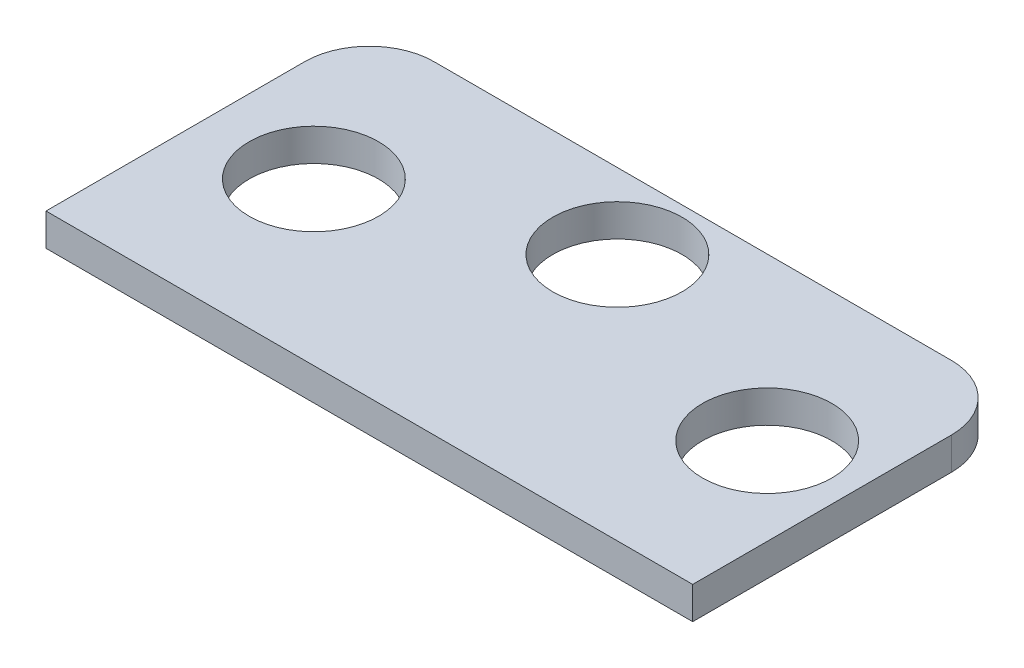
ISO-10303-21;
HEADER;
FILE_DESCRIPTION(('STEP AP214'),'2;1');
FILE_NAME('part.step','',(''),(''),'','','');
FILE_SCHEMA(('AUTOMOTIVE_DESIGN { 1 0 10303 214 1 1 1 1 }'));
ENDSEC;
DATA;
#1=APPLICATION_CONTEXT('core data for automotive mechanical design processes');
#2=APPLICATION_PROTOCOL_DEFINITION('international standard','automotive_design',2000,#1);
#3=PRODUCT_CONTEXT('',#1,'mechanical');
#4=PRODUCT('Part','Part','',(#3));
#5=PRODUCT_RELATED_PRODUCT_CATEGORY('part','',(#4));
#6=PRODUCT_DEFINITION_FORMATION('','',#4);
#7=PRODUCT_DEFINITION_CONTEXT('part definition',#1,'design');
#8=PRODUCT_DEFINITION('design','',#6,#7);
#9=PRODUCT_DEFINITION_SHAPE('','',#8);
#10=(LENGTH_UNIT() NAMED_UNIT(*) SI_UNIT(.MILLI.,.METRE.));
#11=(NAMED_UNIT(*) PLANE_ANGLE_UNIT() SI_UNIT($,.RADIAN.));
#12=(NAMED_UNIT(*) SI_UNIT($,.STERADIAN.) SOLID_ANGLE_UNIT());
#13=UNCERTAINTY_MEASURE_WITH_UNIT(LENGTH_MEASURE(1.E-05),#10,'distance_accuracy_value','');
#14=(GEOMETRIC_REPRESENTATION_CONTEXT(3) GLOBAL_UNCERTAINTY_ASSIGNED_CONTEXT((#13)) GLOBAL_UNIT_ASSIGNED_CONTEXT((#10,
#11,#12)) REPRESENTATION_CONTEXT('',''));
#15=CARTESIAN_POINT('',(0.,0.,0.));
#16=DIRECTION('',(0.,0.,1.));
#17=DIRECTION('',(1.,0.,0.));
#18=AXIS2_PLACEMENT_3D('',#15,#16,#17);
#19=CARTESIAN_POINT('',(80.,10.,-30.));
#20=DIRECTION('',(0.,1.,0.));
#21=DIRECTION('',(0.,0.,1.));
#22=AXIS2_PLACEMENT_3D('',#19,#20,#21);
#23=PLANE('',#22);
#24=CARTESIAN_POINT('',(0.,10.,-26.7156862745098));
#25=DIRECTION('',(0.,1.,0.));
#26=DIRECTION('',(0.,0.,1.));
#27=AXIS2_PLACEMENT_3D('',#24,#25,#26);
#28=CIRCLE('',#27,20.);
#29=CARTESIAN_POINT('',(0.,10.,-6.71568627450982));
#30=VERTEX_POINT('',#29);
#31=EDGE_CURVE('E273',#30,#30,#28,.T.);
#32=ORIENTED_EDGE('',*,*,#31,.F.);
#33=EDGE_LOOP('',(#32));
#34=FACE_BOUND('',#33,.T.);
#35=DIRECTION('',(1.,0.,0.));
#36=VECTOR('',#35,1.);
#37=CARTESIAN_POINT('',(-100.,10.,50.));
#38=LINE('',#37,#36);
#39=CARTESIAN_POINT('',(-100.,10.,50.));
#40=VERTEX_POINT('',#39);
#41=CARTESIAN_POINT('',(100.,10.,50.));
#42=VERTEX_POINT('',#41);
#43=EDGE_CURVE('E153',#40,#42,#38,.T.);
#44=ORIENTED_EDGE('',*,*,#43,.T.);
#45=DIRECTION('',(0.,0.,1.));
#46=VECTOR('',#45,1.);
#47=CARTESIAN_POINT('',(100.,10.,-29.9999999999999));
#48=LINE('',#47,#46);
#49=CARTESIAN_POINT('',(100.,10.,-29.9999999999999));
#50=VERTEX_POINT('',#49);
#51=EDGE_CURVE('E186',#50,#42,#48,.T.);
#52=ORIENTED_EDGE('',*,*,#51,.F.);
#53=CARTESIAN_POINT('',(80.,10.,-30.));
#54=DIRECTION('',(0.,1.,0.));
#55=DIRECTION('',(0.,0.,1.));
#56=AXIS2_PLACEMENT_3D('',#53,#54,#55);
#57=CIRCLE('',#56,20.);
#58=CARTESIAN_POINT('',(79.9999999999998,10.,-50.));
#59=VERTEX_POINT('',#58);
#60=EDGE_CURVE('E181',#50,#59,#57,.T.);
#61=ORIENTED_EDGE('',*,*,#60,.T.);
#62=DIRECTION('',(1.,0.,0.));
#63=VECTOR('',#62,1.);
#64=CARTESIAN_POINT('',(-79.9999999999999,10.,-50.));
#65=LINE('',#64,#63);
#66=CARTESIAN_POINT('',(-79.9999999999999,10.,-50.));
#67=VERTEX_POINT('',#66);
#68=EDGE_CURVE('E168',#67,#59,#65,.T.);
#69=ORIENTED_EDGE('',*,*,#68,.F.);
#70=CARTESIAN_POINT('',(-80.,10.,-30.));
#71=DIRECTION('',(0.,1.,0.));
#72=DIRECTION('',(0.,0.,1.));
#73=AXIS2_PLACEMENT_3D('',#70,#71,#72);
#74=CIRCLE('',#73,20.);
#75=CARTESIAN_POINT('',(-100.,10.,-29.9999999999999));
#76=VERTEX_POINT('',#75);
#77=EDGE_CURVE('E175',#67,#76,#74,.T.);
#78=ORIENTED_EDGE('',*,*,#77,.T.);
#79=DIRECTION('',(0.,0.,1.));
#80=VECTOR('',#79,1.);
#81=CARTESIAN_POINT('',(-100.,10.,-29.9999999999999));
#82=LINE('',#81,#80);
#83=EDGE_CURVE('E120',#76,#40,#82,.T.);
#84=ORIENTED_EDGE('',*,*,#83,.T.);
#85=EDGE_LOOP('',(#44,#52,#61,#69,#78,#84));
#86=FACE_BOUND('',#85,.T.);
#87=CARTESIAN_POINT('',(-67.1568627450981,10.,0.));
#88=DIRECTION('',(0.,1.,0.));
#89=DIRECTION('',(0.,0.,1.));
#90=AXIS2_PLACEMENT_3D('',#87,#88,#89);
#91=CIRCLE('',#90,20.);
#92=CARTESIAN_POINT('',(-67.1568627450981,10.,20.));
#93=VERTEX_POINT('',#92);
#94=EDGE_CURVE('E198',#93,#93,#91,.T.);
#95=ORIENTED_EDGE('',*,*,#94,.F.);
#96=EDGE_LOOP('',(#95));
#97=FACE_BOUND('',#96,.T.);
#98=CARTESIAN_POINT('',(73.0392156862745,10.,0.));
#99=DIRECTION('',(0.,1.,0.));
#100=DIRECTION('',(0.,0.,1.));
#101=AXIS2_PLACEMENT_3D('',#98,#99,#100);
#102=CIRCLE('',#101,20.);
#103=CARTESIAN_POINT('',(73.0392156862745,10.,20.));
#104=VERTEX_POINT('',#103);
#105=EDGE_CURVE('E262',#104,#104,#102,.T.);
#106=ORIENTED_EDGE('',*,*,#105,.F.);
#107=EDGE_LOOP('',(#106));
#108=FACE_BOUND('',#107,.T.);
#109=ADVANCED_FACE('F102',(#34,#86,#97,#108),#23,.T.);
#110=CARTESIAN_POINT('',(80.,0.,-30.));
#111=DIRECTION('',(0.,1.,0.));
#112=DIRECTION('',(0.,0.,1.));
#113=AXIS2_PLACEMENT_3D('',#110,#111,#112);
#114=PLANE('',#113);
#115=DIRECTION('',(1.,0.,0.));
#116=VECTOR('',#115,1.);
#117=CARTESIAN_POINT('',(-100.,0.,50.));
#118=LINE('',#117,#116);
#119=CARTESIAN_POINT('',(-100.,0.,50.));
#120=VERTEX_POINT('',#119);
#121=CARTESIAN_POINT('',(100.,0.,50.));
#122=VERTEX_POINT('',#121);
#123=EDGE_CURVE('E193',#120,#122,#118,.T.);
#124=ORIENTED_EDGE('',*,*,#123,.F.);
#125=DIRECTION('',(0.,0.,1.));
#126=VECTOR('',#125,1.);
#127=CARTESIAN_POINT('',(-100.,0.,-29.9999999999999));
#128=LINE('',#127,#126);
#129=CARTESIAN_POINT('',(-100.,0.,-29.9999999999999));
#130=VERTEX_POINT('',#129);
#131=EDGE_CURVE('E147',#130,#120,#128,.T.);
#132=ORIENTED_EDGE('',*,*,#131,.F.);
#133=CARTESIAN_POINT('',(-80.,0.,-30.));
#134=DIRECTION('',(0.,1.,0.));
#135=DIRECTION('',(0.,0.,1.));
#136=AXIS2_PLACEMENT_3D('',#133,#134,#135);
#137=CIRCLE('',#136,20.);
#138=CARTESIAN_POINT('',(-79.9999999999999,0.,-50.));
#139=VERTEX_POINT('',#138);
#140=EDGE_CURVE('E141',#139,#130,#137,.T.);
#141=ORIENTED_EDGE('',*,*,#140,.F.);
#142=DIRECTION('',(1.,0.,0.));
#143=VECTOR('',#142,1.);
#144=CARTESIAN_POINT('',(-79.9999999999999,0.,-50.));
#145=LINE('',#144,#143);
#146=CARTESIAN_POINT('',(79.9999999999998,0.,-50.));
#147=VERTEX_POINT('',#146);
#148=EDGE_CURVE('E170',#139,#147,#145,.T.);
#149=ORIENTED_EDGE('',*,*,#148,.T.);
#150=CARTESIAN_POINT('',(80.,0.,-30.));
#151=DIRECTION('',(0.,1.,0.));
#152=DIRECTION('',(0.,0.,1.));
#153=AXIS2_PLACEMENT_3D('',#150,#151,#152);
#154=CIRCLE('',#153,20.);
#155=CARTESIAN_POINT('',(100.,0.,-29.9999999999999));
#156=VERTEX_POINT('',#155);
#157=EDGE_CURVE('E202',#156,#147,#154,.T.);
#158=ORIENTED_EDGE('',*,*,#157,.F.);
#159=DIRECTION('',(0.,0.,1.));
#160=VECTOR('',#159,1.);
#161=CARTESIAN_POINT('',(100.,0.,-29.9999999999999));
#162=LINE('',#161,#160);
#163=EDGE_CURVE('E197',#156,#122,#162,.T.);
#164=ORIENTED_EDGE('',*,*,#163,.T.);
#165=EDGE_LOOP('',(#124,#132,#141,#149,#158,#164));
#166=FACE_BOUND('',#165,.T.);
#167=CARTESIAN_POINT('',(-67.1568627450981,0.,0.));
#168=DIRECTION('',(0.,1.,0.));
#169=DIRECTION('',(0.,0.,1.));
#170=AXIS2_PLACEMENT_3D('',#167,#168,#169);
#171=CIRCLE('',#170,20.);
#172=CARTESIAN_POINT('',(-67.1568627450981,0.,20.));
#173=VERTEX_POINT('',#172);
#174=EDGE_CURVE('E277',#173,#173,#171,.T.);
#175=ORIENTED_EDGE('',*,*,#174,.T.);
#176=EDGE_LOOP('',(#175));
#177=FACE_BOUND('',#176,.T.);
#178=CARTESIAN_POINT('',(0.,0.,-26.7156862745098));
#179=DIRECTION('',(0.,1.,0.));
#180=DIRECTION('',(0.,0.,1.));
#181=AXIS2_PLACEMENT_3D('',#178,#179,#180);
#182=CIRCLE('',#181,20.);
#183=CARTESIAN_POINT('',(0.,0.,-6.71568627450982));
#184=VERTEX_POINT('',#183);
#185=EDGE_CURVE('E270',#184,#184,#182,.T.);
#186=ORIENTED_EDGE('',*,*,#185,.T.);
#187=EDGE_LOOP('',(#186));
#188=FACE_BOUND('',#187,.T.);
#189=CARTESIAN_POINT('',(73.0392156862745,0.,0.));
#190=DIRECTION('',(0.,1.,0.));
#191=DIRECTION('',(0.,0.,1.));
#192=AXIS2_PLACEMENT_3D('',#189,#190,#191);
#193=CIRCLE('',#192,20.);
#194=CARTESIAN_POINT('',(73.0392156862745,0.,20.));
#195=VERTEX_POINT('',#194);
#196=EDGE_CURVE('E265',#195,#195,#193,.T.);
#197=ORIENTED_EDGE('',*,*,#196,.T.);
#198=EDGE_LOOP('',(#197));
#199=FACE_BOUND('',#198,.T.);
#200=ADVANCED_FACE('F226',(#166,#177,#188,#199),#114,.F.);
#201=CARTESIAN_POINT('',(-100.,10.,50.));
#202=DIRECTION('',(0.,0.,-1.));
#203=DIRECTION('',(-1.,0.,0.));
#204=AXIS2_PLACEMENT_3D('',#201,#202,#203);
#205=PLANE('',#204);
#206=ORIENTED_EDGE('',*,*,#123,.T.);
#207=DIRECTION('',(0.,-1.,0.));
#208=VECTOR('',#207,1.);
#209=CARTESIAN_POINT('',(100.,10.,50.));
#210=LINE('',#209,#208);
#211=EDGE_CURVE('E12',#42,#122,#210,.T.);
#212=ORIENTED_EDGE('',*,*,#211,.F.);
#213=ORIENTED_EDGE('',*,*,#43,.F.);
#214=DIRECTION('',(0.,-1.,0.));
#215=VECTOR('',#214,1.);
#216=CARTESIAN_POINT('',(-100.,10.,50.));
#217=LINE('',#216,#215);
#218=EDGE_CURVE('E192',#40,#120,#217,.T.);
#219=ORIENTED_EDGE('',*,*,#218,.T.);
#220=EDGE_LOOP('',(#206,#212,#213,#219));
#221=FACE_BOUND('',#220,.T.);
#222=ADVANCED_FACE('F104',(#221),#205,.F.);
#223=CARTESIAN_POINT('',(100.,10.,-29.9999999999999));
#224=DIRECTION('',(1.,0.,0.));
#225=DIRECTION('',(0.,0.,-1.));
#226=AXIS2_PLACEMENT_3D('',#223,#224,#225);
#227=PLANE('',#226);
#228=ORIENTED_EDGE('',*,*,#163,.F.);
#229=DIRECTION('',(0.,-1.,0.));
#230=VECTOR('',#229,1.);
#231=CARTESIAN_POINT('',(100.,10.,-29.9999999999999));
#232=LINE('',#231,#230);
#233=EDGE_CURVE('E112',#50,#156,#232,.T.);
#234=ORIENTED_EDGE('',*,*,#233,.F.);
#235=ORIENTED_EDGE('',*,*,#51,.T.);
#236=ORIENTED_EDGE('',*,*,#211,.T.);
#237=EDGE_LOOP('',(#228,#234,#235,#236));
#238=FACE_BOUND('',#237,.T.);
#239=ADVANCED_FACE('F228',(#238),#227,.T.);
#240=CARTESIAN_POINT('',(80.,10.,-30.));
#241=DIRECTION('',(0.,-1.,0.));
#242=DIRECTION('',(0.,0.,-1.));
#243=AXIS2_PLACEMENT_3D('',#240,#241,#242);
#244=CYLINDRICAL_SURFACE('',#243,20.);
#245=ORIENTED_EDGE('',*,*,#157,.T.);
#246=DIRECTION('',(0.,-1.,0.));
#247=VECTOR('',#246,1.);
#248=CARTESIAN_POINT('',(79.9999999999998,10.,-50.));
#249=LINE('',#248,#247);
#250=EDGE_CURVE('E172',#59,#147,#249,.T.);
#251=ORIENTED_EDGE('',*,*,#250,.F.);
#252=ORIENTED_EDGE('',*,*,#60,.F.);
#253=ORIENTED_EDGE('',*,*,#233,.T.);
#254=EDGE_LOOP('',(#245,#251,#252,#253));
#255=FACE_BOUND('',#254,.T.);
#256=ADVANCED_FACE('F220',(#255),#244,.T.);
#257=CARTESIAN_POINT('',(-79.9999999999999,10.,-50.));
#258=DIRECTION('',(0.,0.,-1.));
#259=DIRECTION('',(-1.,0.,0.));
#260=AXIS2_PLACEMENT_3D('',#257,#258,#259);
#261=PLANE('',#260);
#262=ORIENTED_EDGE('',*,*,#148,.F.);
#263=DIRECTION('',(0.,-1.,0.));
#264=VECTOR('',#263,1.);
#265=CARTESIAN_POINT('',(-79.9999999999999,10.,-50.));
#266=LINE('',#265,#264);
#267=EDGE_CURVE('E164',#67,#139,#266,.T.);
#268=ORIENTED_EDGE('',*,*,#267,.F.);
#269=ORIENTED_EDGE('',*,*,#68,.T.);
#270=ORIENTED_EDGE('',*,*,#250,.T.);
#271=EDGE_LOOP('',(#262,#268,#269,#270));
#272=FACE_BOUND('',#271,.T.);
#273=ADVANCED_FACE('F166',(#272),#261,.T.);
#274=CARTESIAN_POINT('',(-80.,10.,-30.));
#275=DIRECTION('',(0.,-1.,0.));
#276=DIRECTION('',(0.,0.,-1.));
#277=AXIS2_PLACEMENT_3D('',#274,#275,#276);
#278=CYLINDRICAL_SURFACE('',#277,20.);
#279=ORIENTED_EDGE('',*,*,#140,.T.);
#280=DIRECTION('',(0.,-1.,0.));
#281=VECTOR('',#280,1.);
#282=CARTESIAN_POINT('',(-100.,10.,-29.9999999999999));
#283=LINE('',#282,#281);
#284=EDGE_CURVE('E173',#76,#130,#283,.T.);
#285=ORIENTED_EDGE('',*,*,#284,.F.);
#286=ORIENTED_EDGE('',*,*,#77,.F.);
#287=ORIENTED_EDGE('',*,*,#267,.T.);
#288=EDGE_LOOP('',(#279,#285,#286,#287));
#289=FACE_BOUND('',#288,.T.);
#290=ADVANCED_FACE('F176',(#289),#278,.T.);
#291=CARTESIAN_POINT('',(-100.,10.,-29.9999999999999));
#292=DIRECTION('',(1.,0.,0.));
#293=DIRECTION('',(0.,0.,-1.));
#294=AXIS2_PLACEMENT_3D('',#291,#292,#293);
#295=PLANE('',#294);
#296=ORIENTED_EDGE('',*,*,#131,.T.);
#297=ORIENTED_EDGE('',*,*,#218,.F.);
#298=ORIENTED_EDGE('',*,*,#83,.F.);
#299=ORIENTED_EDGE('',*,*,#284,.T.);
#300=EDGE_LOOP('',(#296,#297,#298,#299));
#301=FACE_BOUND('',#300,.T.);
#302=ADVANCED_FACE('F230',(#301),#295,.F.);
#303=CARTESIAN_POINT('',(-67.1568627450981,10.,0.));
#304=DIRECTION('',(0.,-1.,0.));
#305=DIRECTION('',(0.,0.,-1.));
#306=AXIS2_PLACEMENT_3D('',#303,#304,#305);
#307=CYLINDRICAL_SURFACE('',#306,20.);
#308=ORIENTED_EDGE('',*,*,#94,.T.);
#309=EDGE_LOOP('',(#308));
#310=FACE_BOUND('',#309,.T.);
#311=ORIENTED_EDGE('',*,*,#174,.F.);
#312=EDGE_LOOP('',(#311));
#313=FACE_BOUND('',#312,.T.);
#314=ADVANCED_FACE('F232',(#310,#313),#307,.F.);
#315=CARTESIAN_POINT('',(0.,10.,-26.7156862745098));
#316=DIRECTION('',(0.,-1.,0.));
#317=DIRECTION('',(0.,0.,-1.));
#318=AXIS2_PLACEMENT_3D('',#315,#316,#317);
#319=CYLINDRICAL_SURFACE('',#318,20.);
#320=ORIENTED_EDGE('',*,*,#31,.T.);
#321=EDGE_LOOP('',(#320));
#322=FACE_BOUND('',#321,.T.);
#323=ORIENTED_EDGE('',*,*,#185,.F.);
#324=EDGE_LOOP('',(#323));
#325=FACE_BOUND('',#324,.T.);
#326=ADVANCED_FACE('F238',(#322,#325),#319,.F.);
#327=CARTESIAN_POINT('',(73.0392156862745,10.,0.));
#328=DIRECTION('',(0.,-1.,0.));
#329=DIRECTION('',(0.,0.,-1.));
#330=AXIS2_PLACEMENT_3D('',#327,#328,#329);
#331=CYLINDRICAL_SURFACE('',#330,20.);
#332=ORIENTED_EDGE('',*,*,#105,.T.);
#333=EDGE_LOOP('',(#332));
#334=FACE_BOUND('',#333,.T.);
#335=ORIENTED_EDGE('',*,*,#196,.F.);
#336=EDGE_LOOP('',(#335));
#337=FACE_BOUND('',#336,.T.);
#338=ADVANCED_FACE('F253',(#334,#337),#331,.F.);
#339=CLOSED_SHELL('',(#109,#200,#222,#239,#256,#273,#290,#302,#314,#326,#338));
#340=MANIFOLD_SOLID_BREP('B2',#339);
#341=ADVANCED_BREP_SHAPE_REPRESENTATION('',(#18,#340),#14);
#342=SHAPE_DEFINITION_REPRESENTATION(#9,#341);
ENDSEC;
END-ISO-10303-21;
